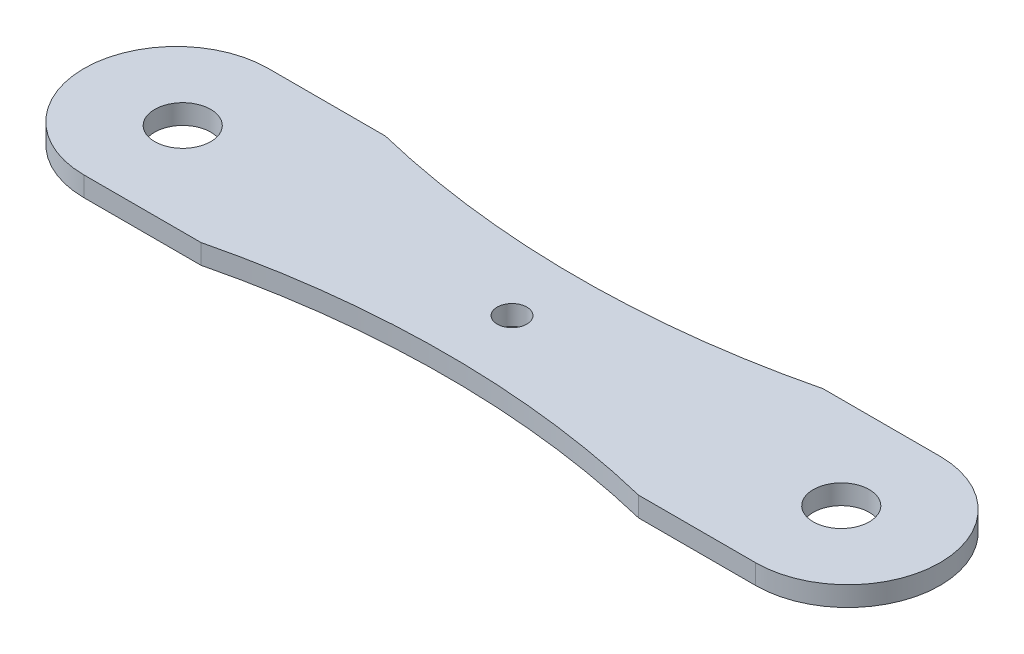
ISO-10303-21;
HEADER;
FILE_DESCRIPTION(('STEP AP214'),'2;1');
FILE_NAME('part.step','',(''),(''),'','','');
FILE_SCHEMA(('AUTOMOTIVE_DESIGN { 1 0 10303 214 1 1 1 1 }'));
ENDSEC;
DATA;
#1=APPLICATION_CONTEXT('core data for automotive mechanical design processes');
#2=APPLICATION_PROTOCOL_DEFINITION('international standard','automotive_design',2000,#1);
#3=PRODUCT_CONTEXT('',#1,'mechanical');
#4=PRODUCT('Part','Part','',(#3));
#5=PRODUCT_RELATED_PRODUCT_CATEGORY('part','',(#4));
#6=PRODUCT_DEFINITION_FORMATION('','',#4);
#7=PRODUCT_DEFINITION_CONTEXT('part definition',#1,'design');
#8=PRODUCT_DEFINITION('design','',#6,#7);
#9=PRODUCT_DEFINITION_SHAPE('','',#8);
#10=(LENGTH_UNIT() NAMED_UNIT(*) SI_UNIT(.MILLI.,.METRE.));
#11=(NAMED_UNIT(*) PLANE_ANGLE_UNIT() SI_UNIT($,.RADIAN.));
#12=(NAMED_UNIT(*) SI_UNIT($,.STERADIAN.) SOLID_ANGLE_UNIT());
#13=UNCERTAINTY_MEASURE_WITH_UNIT(LENGTH_MEASURE(1.E-05),#10,'distance_accuracy_value','');
#14=(GEOMETRIC_REPRESENTATION_CONTEXT(3) GLOBAL_UNCERTAINTY_ASSIGNED_CONTEXT((#13)) GLOBAL_UNIT_ASSIGNED_CONTEXT((#10,
#11,#12)) REPRESENTATION_CONTEXT('',''));
#15=CARTESIAN_POINT('',(0.,0.,0.));
#16=DIRECTION('',(0.,0.,1.));
#17=DIRECTION('',(1.,0.,0.));
#18=AXIS2_PLACEMENT_3D('',#15,#16,#17);
#19=CARTESIAN_POINT('',(51.,0.,0.));
#20=DIRECTION('',(0.,-1.,0.));
#21=DIRECTION('',(0.,0.,-1.));
#22=AXIS2_PLACEMENT_3D('',#19,#20,#21);
#23=CYLINDRICAL_SURFACE('',#22,14.);
#24=DIRECTION('',(0.,1.,0.));
#25=VECTOR('',#24,1.);
#26=CARTESIAN_POINT('',(51.,0.,14.));
#27=LINE('',#26,#25);
#28=CARTESIAN_POINT('',(51.,0.,14.));
#29=VERTEX_POINT('',#28);
#30=CARTESIAN_POINT('',(51.,3.,14.));
#31=VERTEX_POINT('',#30);
#32=EDGE_CURVE('E141',#29,#31,#27,.T.);
#33=ORIENTED_EDGE('',*,*,#32,.F.);
#34=CARTESIAN_POINT('',(51.,0.,0.));
#35=DIRECTION('',(0.,1.,0.));
#36=DIRECTION('',(0.,0.,1.));
#37=AXIS2_PLACEMENT_3D('',#34,#35,#36);
#38=CIRCLE('',#37,14.);
#39=CARTESIAN_POINT('',(51.,0.,-14.));
#40=VERTEX_POINT('',#39);
#41=EDGE_CURVE('E42',#40,#29,#38,.F.);
#42=ORIENTED_EDGE('',*,*,#41,.F.);
#43=DIRECTION('',(0.,-1.,0.));
#44=VECTOR('',#43,1.);
#45=CARTESIAN_POINT('',(51.,3.,-14.));
#46=LINE('',#45,#44);
#47=CARTESIAN_POINT('',(51.,3.,-14.));
#48=VERTEX_POINT('',#47);
#49=EDGE_CURVE('E144',#48,#40,#46,.T.);
#50=ORIENTED_EDGE('',*,*,#49,.F.);
#51=CARTESIAN_POINT('',(51.,3.,0.));
#52=DIRECTION('',(0.,1.,0.));
#53=DIRECTION('',(0.,0.,1.));
#54=AXIS2_PLACEMENT_3D('',#51,#52,#53);
#55=CIRCLE('',#54,14.);
#56=EDGE_CURVE('E11',#31,#48,#55,.T.);
#57=ORIENTED_EDGE('',*,*,#56,.F.);
#58=EDGE_LOOP('',(#33,#42,#50,#57));
#59=FACE_BOUND('',#58,.T.);
#60=ADVANCED_FACE('F35',(#59),#23,.T.);
#61=CARTESIAN_POINT('',(0.,3.,14.));
#62=DIRECTION('',(0.,0.,-1.));
#63=DIRECTION('',(-1.,0.,0.));
#64=AXIS2_PLACEMENT_3D('',#61,#62,#63);
#65=PLANE('',#64);
#66=DIRECTION('',(0.,1.,0.));
#67=VECTOR('',#66,1.);
#68=CARTESIAN_POINT('',(-33.2264954516723,-0.00100000000000013,14.));
#69=LINE('',#68,#67);
#70=CARTESIAN_POINT('',(-33.2264954516723,0.,14.));
#71=VERTEX_POINT('',#70);
#72=CARTESIAN_POINT('',(-33.2264954516723,3.,14.));
#73=VERTEX_POINT('',#72);
#74=EDGE_CURVE('E99',#71,#73,#69,.T.);
#75=ORIENTED_EDGE('',*,*,#74,.T.);
#76=DIRECTION('',(1.,0.,0.));
#77=VECTOR('',#76,1.);
#78=CARTESIAN_POINT('',(0.,3.,14.));
#79=LINE('',#78,#77);
#80=CARTESIAN_POINT('',(-51.,3.,14.));
#81=VERTEX_POINT('',#80);
#82=EDGE_CURVE('E112',#81,#73,#79,.T.);
#83=ORIENTED_EDGE('',*,*,#82,.F.);
#84=DIRECTION('',(0.,-1.,0.));
#85=VECTOR('',#84,1.);
#86=CARTESIAN_POINT('',(-51.,3.,14.));
#87=LINE('',#86,#85);
#88=CARTESIAN_POINT('',(-51.,0.,14.));
#89=VERTEX_POINT('',#88);
#90=EDGE_CURVE('E120',#81,#89,#87,.T.);
#91=ORIENTED_EDGE('',*,*,#90,.T.);
#92=DIRECTION('',(1.,0.,0.));
#93=VECTOR('',#92,1.);
#94=CARTESIAN_POINT('',(0.,0.,14.));
#95=LINE('',#94,#93);
#96=EDGE_CURVE('E114',#89,#71,#95,.T.);
#97=ORIENTED_EDGE('',*,*,#96,.T.);
#98=EDGE_LOOP('',(#75,#83,#91,#97));
#99=FACE_BOUND('',#98,.T.);
#100=ADVANCED_FACE('F110',(#99),#65,.F.);
#101=CARTESIAN_POINT('',(33.2264954516723,0.,14.));
#102=VERTEX_POINT('',#101);
#103=EDGE_CURVE('E132',#102,#29,#95,.T.);
#104=ORIENTED_EDGE('',*,*,#103,.T.);
#105=ORIENTED_EDGE('',*,*,#32,.T.);
#106=CARTESIAN_POINT('',(33.2264954516723,3.,14.));
#107=VERTEX_POINT('',#106);
#108=EDGE_CURVE('E121',#107,#31,#79,.T.);
#109=ORIENTED_EDGE('',*,*,#108,.F.);
#110=DIRECTION('',(0.,1.,0.));
#111=VECTOR('',#110,1.);
#112=CARTESIAN_POINT('',(33.2264954516723,-0.00100000000000013,14.));
#113=LINE('',#112,#111);
#114=EDGE_CURVE('E102',#107,#102,#113,.F.);
#115=ORIENTED_EDGE('',*,*,#114,.T.);
#116=EDGE_LOOP('',(#104,#105,#109,#115));
#117=FACE_BOUND('',#116,.T.);
#118=ADVANCED_FACE('F153',(#117),#65,.F.);
#119=CARTESIAN_POINT('',(0.,3.,0.));
#120=DIRECTION('',(0.,1.,0.));
#121=DIRECTION('',(0.,0.,1.));
#122=AXIS2_PLACEMENT_3D('',#119,#120,#121);
#123=PLANE('',#122);
#124=CARTESIAN_POINT('',(-50.,3.,0.));
#125=DIRECTION('',(0.,1.,0.));
#126=DIRECTION('',(0.,0.,1.));
#127=AXIS2_PLACEMENT_3D('',#124,#125,#126);
#128=CIRCLE('',#127,4.25000000000001);
#129=CARTESIAN_POINT('',(-50.,3.,4.25000000000001));
#130=VERTEX_POINT('',#129);
#131=EDGE_CURVE('E179',#130,#130,#128,.T.);
#132=ORIENTED_EDGE('',*,*,#131,.F.);
#133=EDGE_LOOP('',(#132));
#134=FACE_BOUND('',#133,.T.);
#135=CARTESIAN_POINT('',(50.,3.,0.));
#136=DIRECTION('',(0.,1.,0.));
#137=DIRECTION('',(0.,0.,1.));
#138=AXIS2_PLACEMENT_3D('',#135,#136,#137);
#139=CIRCLE('',#138,4.25000000000001);
#140=CARTESIAN_POINT('',(50.,3.,4.25000000000001));
#141=VERTEX_POINT('',#140);
#142=EDGE_CURVE('E173',#141,#141,#139,.T.);
#143=ORIENTED_EDGE('',*,*,#142,.F.);
#144=EDGE_LOOP('',(#143));
#145=FACE_BOUND('',#144,.T.);
#146=CARTESIAN_POINT('',(0.,3.,0.));
#147=DIRECTION('',(0.,1.,0.));
#148=DIRECTION('',(0.,0.,1.));
#149=AXIS2_PLACEMENT_3D('',#146,#147,#148);
#150=CIRCLE('',#149,2.25);
#151=CARTESIAN_POINT('',(0.,3.,2.25));
#152=VERTEX_POINT('',#151);
#153=EDGE_CURVE('E167',#152,#152,#150,.T.);
#154=ORIENTED_EDGE('',*,*,#153,.F.);
#155=EDGE_LOOP('',(#154));
#156=FACE_BOUND('',#155,.T.);
#157=ORIENTED_EDGE('',*,*,#108,.T.);
#158=ORIENTED_EDGE('',*,*,#56,.T.);
#159=DIRECTION('',(1.,0.,0.));
#160=VECTOR('',#159,1.);
#161=CARTESIAN_POINT('',(0.,3.,-14.));
#162=LINE('',#161,#160);
#163=CARTESIAN_POINT('',(33.2264954516724,3.,-14.));
#164=VERTEX_POINT('',#163);
#165=EDGE_CURVE('E134',#164,#48,#162,.T.);
#166=ORIENTED_EDGE('',*,*,#165,.F.);
#167=CARTESIAN_POINT('',(0.,3.,-150.));
#168=DIRECTION('',(0.,1.,0.));
#169=DIRECTION('',(0.,0.,1.));
#170=AXIS2_PLACEMENT_3D('',#167,#168,#169);
#171=CIRCLE('',#170,140.);
#172=CARTESIAN_POINT('',(-33.2264954516724,3.,-14.));
#173=VERTEX_POINT('',#172);
#174=EDGE_CURVE('E163',#173,#164,#171,.T.);
#175=ORIENTED_EDGE('',*,*,#174,.F.);
#176=CARTESIAN_POINT('',(-51.,3.,-14.));
#177=VERTEX_POINT('',#176);
#178=EDGE_CURVE('E125',#177,#173,#162,.T.);
#179=ORIENTED_EDGE('',*,*,#178,.F.);
#180=CARTESIAN_POINT('',(-51.,3.,0.));
#181=DIRECTION('',(0.,1.,0.));
#182=DIRECTION('',(0.,0.,1.));
#183=AXIS2_PLACEMENT_3D('',#180,#181,#182);
#184=CIRCLE('',#183,14.);
#185=EDGE_CURVE('E118',#177,#81,#184,.T.);
#186=ORIENTED_EDGE('',*,*,#185,.T.);
#187=ORIENTED_EDGE('',*,*,#82,.T.);
#188=CARTESIAN_POINT('',(0.,3.,150.));
#189=DIRECTION('',(0.,-1.,0.));
#190=DIRECTION('',(0.,0.,-1.));
#191=AXIS2_PLACEMENT_3D('',#188,#189,#190);
#192=CIRCLE('',#191,140.);
#193=EDGE_CURVE('E96',#73,#107,#192,.T.);
#194=ORIENTED_EDGE('',*,*,#193,.T.);
#195=EDGE_LOOP('',(#157,#158,#166,#175,#179,#186,#187,#194));
#196=FACE_BOUND('',#195,.T.);
#197=ADVANCED_FACE('F116',(#134,#145,#156,#196),#123,.T.);
#198=CARTESIAN_POINT('',(0.,0.,0.));
#199=DIRECTION('',(0.,1.,0.));
#200=DIRECTION('',(0.,0.,1.));
#201=AXIS2_PLACEMENT_3D('',#198,#199,#200);
#202=PLANE('',#201);
#203=CARTESIAN_POINT('',(-50.,0.,0.));
#204=DIRECTION('',(0.,1.,0.));
#205=DIRECTION('',(0.,0.,1.));
#206=AXIS2_PLACEMENT_3D('',#203,#204,#205);
#207=CIRCLE('',#206,4.25000000000001);
#208=CARTESIAN_POINT('',(-50.,0.,4.25000000000001));
#209=VERTEX_POINT('',#208);
#210=EDGE_CURVE('E181',#209,#209,#207,.F.);
#211=ORIENTED_EDGE('',*,*,#210,.F.);
#212=EDGE_LOOP('',(#211));
#213=FACE_BOUND('',#212,.T.);
#214=CARTESIAN_POINT('',(50.,0.,0.));
#215=DIRECTION('',(0.,1.,0.));
#216=DIRECTION('',(0.,0.,1.));
#217=AXIS2_PLACEMENT_3D('',#214,#215,#216);
#218=CIRCLE('',#217,4.25000000000001);
#219=CARTESIAN_POINT('',(50.,0.,4.25000000000001));
#220=VERTEX_POINT('',#219);
#221=EDGE_CURVE('E176',#220,#220,#218,.F.);
#222=ORIENTED_EDGE('',*,*,#221,.F.);
#223=EDGE_LOOP('',(#222));
#224=FACE_BOUND('',#223,.T.);
#225=CARTESIAN_POINT('',(0.,0.,0.));
#226=DIRECTION('',(0.,1.,0.));
#227=DIRECTION('',(0.,0.,1.));
#228=AXIS2_PLACEMENT_3D('',#225,#226,#227);
#229=CIRCLE('',#228,2.25);
#230=CARTESIAN_POINT('',(0.,0.,2.25));
#231=VERTEX_POINT('',#230);
#232=EDGE_CURVE('E170',#231,#231,#229,.F.);
#233=ORIENTED_EDGE('',*,*,#232,.F.);
#234=EDGE_LOOP('',(#233));
#235=FACE_BOUND('',#234,.T.);
#236=DIRECTION('',(1.,0.,0.));
#237=VECTOR('',#236,1.);
#238=CARTESIAN_POINT('',(0.,0.,-14.));
#239=LINE('',#238,#237);
#240=CARTESIAN_POINT('',(33.2264954516724,0.,-14.));
#241=VERTEX_POINT('',#240);
#242=EDGE_CURVE('E133',#241,#40,#239,.T.);
#243=ORIENTED_EDGE('',*,*,#242,.T.);
#244=ORIENTED_EDGE('',*,*,#41,.T.);
#245=ORIENTED_EDGE('',*,*,#103,.F.);
#246=CARTESIAN_POINT('',(0.,0.,150.));
#247=DIRECTION('',(0.,1.,0.));
#248=DIRECTION('',(0.,0.,1.));
#249=AXIS2_PLACEMENT_3D('',#246,#247,#248);
#250=CIRCLE('',#249,140.);
#251=EDGE_CURVE('E105',#102,#71,#250,.T.);
#252=ORIENTED_EDGE('',*,*,#251,.T.);
#253=ORIENTED_EDGE('',*,*,#96,.F.);
#254=CARTESIAN_POINT('',(-51.,0.,0.));
#255=DIRECTION('',(0.,1.,0.));
#256=DIRECTION('',(0.,0.,1.));
#257=AXIS2_PLACEMENT_3D('',#254,#255,#256);
#258=CIRCLE('',#257,14.);
#259=CARTESIAN_POINT('',(-51.,0.,-14.));
#260=VERTEX_POINT('',#259);
#261=EDGE_CURVE('E139',#89,#260,#258,.F.);
#262=ORIENTED_EDGE('',*,*,#261,.T.);
#263=CARTESIAN_POINT('',(-33.2264954516724,0.,-14.));
#264=VERTEX_POINT('',#263);
#265=EDGE_CURVE('E129',#260,#264,#239,.T.);
#266=ORIENTED_EDGE('',*,*,#265,.T.);
#267=CARTESIAN_POINT('',(0.,0.,-150.));
#268=DIRECTION('',(0.,1.,0.));
#269=DIRECTION('',(0.,0.,1.));
#270=AXIS2_PLACEMENT_3D('',#267,#268,#269);
#271=CIRCLE('',#270,140.);
#272=EDGE_CURVE('E165',#241,#264,#271,.F.);
#273=ORIENTED_EDGE('',*,*,#272,.F.);
#274=EDGE_LOOP('',(#243,#244,#245,#252,#253,#262,#266,#273));
#275=FACE_BOUND('',#274,.T.);
#276=ADVANCED_FACE('F148',(#213,#224,#235,#275),#202,.F.);
#277=CARTESIAN_POINT('',(0.,3.,-14.));
#278=DIRECTION('',(0.,0.,-1.));
#279=DIRECTION('',(-1.,0.,0.));
#280=AXIS2_PLACEMENT_3D('',#277,#278,#279);
#281=PLANE('',#280);
#282=DIRECTION('',(0.,1.,0.));
#283=VECTOR('',#282,1.);
#284=CARTESIAN_POINT('',(-33.2264954516724,-0.00100000000000013,-14.));
#285=LINE('',#284,#283);
#286=EDGE_CURVE('E160',#173,#264,#285,.F.);
#287=ORIENTED_EDGE('',*,*,#286,.T.);
#288=ORIENTED_EDGE('',*,*,#265,.F.);
#289=DIRECTION('',(0.,1.,0.));
#290=VECTOR('',#289,1.);
#291=CARTESIAN_POINT('',(-51.,3.,-14.));
#292=LINE('',#291,#290);
#293=EDGE_CURVE('E123',#260,#177,#292,.T.);
#294=ORIENTED_EDGE('',*,*,#293,.T.);
#295=ORIENTED_EDGE('',*,*,#178,.T.);
#296=EDGE_LOOP('',(#287,#288,#294,#295));
#297=FACE_BOUND('',#296,.T.);
#298=ADVANCED_FACE('F189',(#297),#281,.T.);
#299=CARTESIAN_POINT('',(-51.,3.,0.));
#300=DIRECTION('',(0.,-1.,0.));
#301=DIRECTION('',(0.,0.,-1.));
#302=AXIS2_PLACEMENT_3D('',#299,#300,#301);
#303=CYLINDRICAL_SURFACE('',#302,14.);
#304=ORIENTED_EDGE('',*,*,#90,.F.);
#305=ORIENTED_EDGE('',*,*,#185,.F.);
#306=ORIENTED_EDGE('',*,*,#293,.F.);
#307=ORIENTED_EDGE('',*,*,#261,.F.);
#308=EDGE_LOOP('',(#304,#305,#306,#307));
#309=FACE_BOUND('',#308,.T.);
#310=ADVANCED_FACE('F223',(#309),#303,.T.);
#311=ORIENTED_EDGE('',*,*,#165,.T.);
#312=ORIENTED_EDGE('',*,*,#49,.T.);
#313=ORIENTED_EDGE('',*,*,#242,.F.);
#314=DIRECTION('',(0.,1.,0.));
#315=VECTOR('',#314,1.);
#316=CARTESIAN_POINT('',(33.2264954516724,-0.00100000000000013,-14.));
#317=LINE('',#316,#315);
#318=EDGE_CURVE('E157',#241,#164,#317,.T.);
#319=ORIENTED_EDGE('',*,*,#318,.T.);
#320=EDGE_LOOP('',(#311,#312,#313,#319));
#321=FACE_BOUND('',#320,.T.);
#322=ADVANCED_FACE('F221',(#321),#281,.T.);
#323=CARTESIAN_POINT('',(-50.,-0.00100000000000013,0.));
#324=DIRECTION('',(0.,1.,0.));
#325=DIRECTION('',(0.,0.,1.));
#326=AXIS2_PLACEMENT_3D('',#323,#324,#325);
#327=CYLINDRICAL_SURFACE('',#326,4.25000000000001);
#328=CARTESIAN_POINT('',(-50.,3.,4.25000000000001));
#329=CARTESIAN_POINT('',(-50.,2.96875,4.25000000000001));
#330=CARTESIAN_POINT('',(-50.,2.9375,4.25000000000001));
#331=CARTESIAN_POINT('',(-50.,2.875,4.25000000000001));
#332=CARTESIAN_POINT('',(-50.,2.84375,4.25000000000001));
#333=CARTESIAN_POINT('',(-50.,2.78125,4.25000000000001));
#334=CARTESIAN_POINT('',(-50.,2.75,4.25000000000001));
#335=CARTESIAN_POINT('',(-50.,2.6875,4.25000000000001));
#336=CARTESIAN_POINT('',(-50.,2.65625,4.25000000000001));
#337=CARTESIAN_POINT('',(-50.,2.59375,4.25000000000001));
#338=CARTESIAN_POINT('',(-50.,2.5625,4.25000000000001));
#339=CARTESIAN_POINT('',(-50.,2.5,4.25000000000001));
#340=CARTESIAN_POINT('',(-50.,2.46875,4.25000000000001));
#341=CARTESIAN_POINT('',(-50.,2.40625,4.25000000000001));
#342=CARTESIAN_POINT('',(-50.,2.375,4.25000000000001));
#343=CARTESIAN_POINT('',(-50.,2.3125,4.25000000000001));
#344=CARTESIAN_POINT('',(-50.,2.28125,4.25000000000001));
#345=CARTESIAN_POINT('',(-50.,2.21875,4.25000000000001));
#346=CARTESIAN_POINT('',(-50.,2.1875,4.25000000000001));
#347=CARTESIAN_POINT('',(-50.,2.125,4.25000000000001));
#348=CARTESIAN_POINT('',(-50.,2.09375,4.25000000000001));
#349=CARTESIAN_POINT('',(-50.,2.03125,4.25000000000001));
#350=CARTESIAN_POINT('',(-50.,2.,4.25000000000001));
#351=CARTESIAN_POINT('',(-50.,1.9375,4.25000000000001));
#352=CARTESIAN_POINT('',(-50.,1.90625,4.25000000000001));
#353=CARTESIAN_POINT('',(-50.,1.84375,4.25000000000001));
#354=CARTESIAN_POINT('',(-50.,1.8125,4.25000000000001));
#355=CARTESIAN_POINT('',(-50.,1.75,4.25000000000001));
#356=CARTESIAN_POINT('',(-50.,1.71875,4.25000000000001));
#357=CARTESIAN_POINT('',(-50.,1.65625,4.25000000000001));
#358=CARTESIAN_POINT('',(-50.,1.625,4.25000000000001));
#359=CARTESIAN_POINT('',(-50.,1.5625,4.25000000000001));
#360=CARTESIAN_POINT('',(-50.,1.53125,4.25000000000001));
#361=CARTESIAN_POINT('',(-50.,1.46875,4.25000000000001));
#362=CARTESIAN_POINT('',(-50.,1.4375,4.25000000000001));
#363=CARTESIAN_POINT('',(-50.,1.375,4.25000000000001));
#364=CARTESIAN_POINT('',(-50.,1.34375,4.25000000000001));
#365=CARTESIAN_POINT('',(-50.,1.28125,4.25000000000001));
#366=CARTESIAN_POINT('',(-50.,1.25,4.25000000000001));
#367=CARTESIAN_POINT('',(-50.,1.1875,4.25000000000001));
#368=CARTESIAN_POINT('',(-50.,1.15625,4.25000000000001));
#369=CARTESIAN_POINT('',(-50.,1.09375,4.25000000000001));
#370=CARTESIAN_POINT('',(-50.,1.0625,4.25000000000001));
#371=CARTESIAN_POINT('',(-50.,1.,4.25000000000001));
#372=CARTESIAN_POINT('',(-50.,0.96875,4.25000000000001));
#373=CARTESIAN_POINT('',(-50.,0.90625,4.25000000000001));
#374=CARTESIAN_POINT('',(-50.,0.875,4.25000000000001));
#375=CARTESIAN_POINT('',(-50.,0.8125,4.25000000000001));
#376=CARTESIAN_POINT('',(-50.,0.78125,4.25000000000001));
#377=CARTESIAN_POINT('',(-50.,0.71875,4.25000000000001));
#378=CARTESIAN_POINT('',(-50.,0.6875,4.25000000000001));
#379=CARTESIAN_POINT('',(-50.,0.625,4.25000000000001));
#380=CARTESIAN_POINT('',(-50.,0.59375,4.25000000000001));
#381=CARTESIAN_POINT('',(-50.,0.53125,4.25000000000001));
#382=CARTESIAN_POINT('',(-50.,0.5,4.25000000000001));
#383=CARTESIAN_POINT('',(-50.,0.4375,4.25000000000001));
#384=CARTESIAN_POINT('',(-50.,0.40625,4.25000000000001));
#385=CARTESIAN_POINT('',(-50.,0.34375,4.25000000000001));
#386=CARTESIAN_POINT('',(-50.,0.3125,4.25000000000001));
#387=CARTESIAN_POINT('',(-50.,0.25,4.25000000000001));
#388=CARTESIAN_POINT('',(-50.,0.21875,4.25000000000001));
#389=CARTESIAN_POINT('',(-50.,0.15625,4.25000000000001));
#390=CARTESIAN_POINT('',(-50.,0.125,4.25000000000001));
#391=CARTESIAN_POINT('',(-50.,0.0625000000000001,4.25000000000001));
#392=CARTESIAN_POINT('',(-50.,0.0312500000000001,4.25000000000001));
#393=CARTESIAN_POINT('',(-50.,0.,4.25000000000001));
#394=B_SPLINE_CURVE_WITH_KNOTS('',3,(#328,#329,#330,#331,#332,#333,#334,#335,#336,#337,#338,
#339,#340,#341,#342,#343,#344,#345,#346,#347,#348,#349,#350,#351,#352,#353,#354,#355,#356,#357,
#358,#359,#360,#361,#362,#363,#364,#365,#366,#367,#368,#369,#370,#371,#372,#373,#374,#375,#376,
#377,#378,#379,#380,#381,#382,#383,#384,#385,#386,#387,#388,#389,#390,#391,#392,#393),
.UNSPECIFIED.,.F.,.F.,(4,2,2,2,2,2,2,2,2,2,2,2,2,2,2,2,2,2,2,2,2,2,2,2,2,2,2,2,2,2,2,2,4),(0.,
0.0937500000000001,0.1875,0.28125,0.375,0.46875,0.5625,0.65625,0.75,0.84375,0.9375,1.03125,
1.125,1.21875,1.3125,1.40625,1.5,1.59375,1.6875,1.78125,1.875,1.96875,2.0625,2.15625,2.25,
2.34375,2.4375,2.53125,2.625,2.71875,2.8125,2.90625,3.),.UNSPECIFIED.);
#395=EDGE_CURVE('BSEAM185',#130,#209,#394,.T.);
#396=ORIENTED_EDGE('',*,*,#131,.T.);
#397=ORIENTED_EDGE('',*,*,#210,.T.);
#398=ORIENTED_EDGE('',*,*,#395,.T.);
#399=ORIENTED_EDGE('',*,*,#395,.F.);
#400=EDGE_LOOP('',(#396,#398,#397,#399));
#401=FACE_BOUND('',#400,.T.);
#402=ADVANCED_FACE('F185',(#401),#327,.F.);
#403=CARTESIAN_POINT('',(50.,-0.00100000000000013,0.));
#404=DIRECTION('',(0.,1.,0.));
#405=DIRECTION('',(0.,0.,1.));
#406=AXIS2_PLACEMENT_3D('',#403,#404,#405);
#407=CYLINDRICAL_SURFACE('',#406,4.25000000000001);
#408=CARTESIAN_POINT('',(50.,3.,4.25000000000001));
#409=CARTESIAN_POINT('',(50.,2.96875,4.25000000000001));
#410=CARTESIAN_POINT('',(50.,2.9375,4.25000000000001));
#411=CARTESIAN_POINT('',(50.,2.875,4.25000000000001));
#412=CARTESIAN_POINT('',(50.,2.84375,4.25000000000001));
#413=CARTESIAN_POINT('',(50.,2.78125,4.25000000000001));
#414=CARTESIAN_POINT('',(50.,2.75,4.25000000000001));
#415=CARTESIAN_POINT('',(50.,2.6875,4.25000000000001));
#416=CARTESIAN_POINT('',(50.,2.65625,4.25000000000001));
#417=CARTESIAN_POINT('',(50.,2.59375,4.25000000000001));
#418=CARTESIAN_POINT('',(50.,2.5625,4.25000000000001));
#419=CARTESIAN_POINT('',(50.,2.5,4.25000000000001));
#420=CARTESIAN_POINT('',(50.,2.46875,4.25000000000001));
#421=CARTESIAN_POINT('',(50.,2.40625,4.25000000000001));
#422=CARTESIAN_POINT('',(50.,2.375,4.25000000000001));
#423=CARTESIAN_POINT('',(50.,2.3125,4.25000000000001));
#424=CARTESIAN_POINT('',(50.,2.28125,4.25000000000001));
#425=CARTESIAN_POINT('',(50.,2.21875,4.25000000000001));
#426=CARTESIAN_POINT('',(50.,2.1875,4.25000000000001));
#427=CARTESIAN_POINT('',(50.,2.125,4.25000000000001));
#428=CARTESIAN_POINT('',(50.,2.09375,4.25000000000001));
#429=CARTESIAN_POINT('',(50.,2.03125,4.25000000000001));
#430=CARTESIAN_POINT('',(50.,2.,4.25000000000001));
#431=CARTESIAN_POINT('',(50.,1.9375,4.25000000000001));
#432=CARTESIAN_POINT('',(50.,1.90625,4.25000000000001));
#433=CARTESIAN_POINT('',(50.,1.84375,4.25000000000001));
#434=CARTESIAN_POINT('',(50.,1.8125,4.25000000000001));
#435=CARTESIAN_POINT('',(50.,1.75,4.25000000000001));
#436=CARTESIAN_POINT('',(50.,1.71875,4.25000000000001));
#437=CARTESIAN_POINT('',(50.,1.65625,4.25000000000001));
#438=CARTESIAN_POINT('',(50.,1.625,4.25000000000001));
#439=CARTESIAN_POINT('',(50.,1.5625,4.25000000000001));
#440=CARTESIAN_POINT('',(50.,1.53125,4.25000000000001));
#441=CARTESIAN_POINT('',(50.,1.46875,4.25000000000001));
#442=CARTESIAN_POINT('',(50.,1.4375,4.25000000000001));
#443=CARTESIAN_POINT('',(50.,1.375,4.25000000000001));
#444=CARTESIAN_POINT('',(50.,1.34375,4.25000000000001));
#445=CARTESIAN_POINT('',(50.,1.28125,4.25000000000001));
#446=CARTESIAN_POINT('',(50.,1.25,4.25000000000001));
#447=CARTESIAN_POINT('',(50.,1.1875,4.25000000000001));
#448=CARTESIAN_POINT('',(50.,1.15625,4.25000000000001));
#449=CARTESIAN_POINT('',(50.,1.09375,4.25000000000001));
#450=CARTESIAN_POINT('',(50.,1.0625,4.25000000000001));
#451=CARTESIAN_POINT('',(50.,1.,4.25000000000001));
#452=CARTESIAN_POINT('',(50.,0.96875,4.25000000000001));
#453=CARTESIAN_POINT('',(50.,0.90625,4.25000000000001));
#454=CARTESIAN_POINT('',(50.,0.875,4.25000000000001));
#455=CARTESIAN_POINT('',(50.,0.8125,4.25000000000001));
#456=CARTESIAN_POINT('',(50.,0.78125,4.25000000000001));
#457=CARTESIAN_POINT('',(50.,0.71875,4.25000000000001));
#458=CARTESIAN_POINT('',(50.,0.6875,4.25000000000001));
#459=CARTESIAN_POINT('',(50.,0.625,4.25000000000001));
#460=CARTESIAN_POINT('',(50.,0.59375,4.25000000000001));
#461=CARTESIAN_POINT('',(50.,0.53125,4.25000000000001));
#462=CARTESIAN_POINT('',(50.,0.5,4.25000000000001));
#463=CARTESIAN_POINT('',(50.,0.4375,4.25000000000001));
#464=CARTESIAN_POINT('',(50.,0.40625,4.25000000000001));
#465=CARTESIAN_POINT('',(50.,0.34375,4.25000000000001));
#466=CARTESIAN_POINT('',(50.,0.3125,4.25000000000001));
#467=CARTESIAN_POINT('',(50.,0.25,4.25000000000001));
#468=CARTESIAN_POINT('',(50.,0.21875,4.25000000000001));
#469=CARTESIAN_POINT('',(50.,0.15625,4.25000000000001));
#470=CARTESIAN_POINT('',(50.,0.125,4.25000000000001));
#471=CARTESIAN_POINT('',(50.,0.0625000000000001,4.25000000000001));
#472=CARTESIAN_POINT('',(50.,0.0312500000000001,4.25000000000001));
#473=CARTESIAN_POINT('',(50.,0.,4.25000000000001));
#474=B_SPLINE_CURVE_WITH_KNOTS('',3,(#408,#409,#410,#411,#412,#413,#414,#415,#416,#417,#418,
#419,#420,#421,#422,#423,#424,#425,#426,#427,#428,#429,#430,#431,#432,#433,#434,#435,#436,#437,
#438,#439,#440,#441,#442,#443,#444,#445,#446,#447,#448,#449,#450,#451,#452,#453,#454,#455,#456,
#457,#458,#459,#460,#461,#462,#463,#464,#465,#466,#467,#468,#469,#470,#471,#472,#473),
.UNSPECIFIED.,.F.,.F.,(4,2,2,2,2,2,2,2,2,2,2,2,2,2,2,2,2,2,2,2,2,2,2,2,2,2,2,2,2,2,2,2,4),(0.,
0.0937500000000001,0.1875,0.28125,0.375,0.46875,0.5625,0.65625,0.75,0.84375,0.9375,1.03125,
1.125,1.21875,1.3125,1.40625,1.5,1.59375,1.6875,1.78125,1.875,1.96875,2.0625,2.15625,2.25,
2.34375,2.4375,2.53125,2.625,2.71875,2.8125,2.90625,3.),.UNSPECIFIED.);
#475=EDGE_CURVE('BSEAM198',#141,#220,#474,.T.);
#476=ORIENTED_EDGE('',*,*,#142,.T.);
#477=ORIENTED_EDGE('',*,*,#221,.T.);
#478=ORIENTED_EDGE('',*,*,#475,.T.);
#479=ORIENTED_EDGE('',*,*,#475,.F.);
#480=EDGE_LOOP('',(#476,#478,#477,#479));
#481=FACE_BOUND('',#480,.T.);
#482=ADVANCED_FACE('F198',(#481),#407,.F.);
#483=CARTESIAN_POINT('',(0.,-0.00100000000000013,0.));
#484=DIRECTION('',(0.,1.,0.));
#485=DIRECTION('',(0.,0.,1.));
#486=AXIS2_PLACEMENT_3D('',#483,#484,#485);
#487=CYLINDRICAL_SURFACE('',#486,2.25);
#488=CARTESIAN_POINT('',(0.,3.,2.25));
#489=CARTESIAN_POINT('',(0.,2.96875,2.25));
#490=CARTESIAN_POINT('',(0.,2.9375,2.25));
#491=CARTESIAN_POINT('',(0.,2.875,2.25));
#492=CARTESIAN_POINT('',(0.,2.84375,2.25));
#493=CARTESIAN_POINT('',(0.,2.78125,2.25));
#494=CARTESIAN_POINT('',(0.,2.75,2.25));
#495=CARTESIAN_POINT('',(0.,2.6875,2.25));
#496=CARTESIAN_POINT('',(0.,2.65625,2.25));
#497=CARTESIAN_POINT('',(0.,2.59375,2.25));
#498=CARTESIAN_POINT('',(0.,2.5625,2.25));
#499=CARTESIAN_POINT('',(0.,2.5,2.25));
#500=CARTESIAN_POINT('',(0.,2.46875,2.25));
#501=CARTESIAN_POINT('',(0.,2.40625,2.25));
#502=CARTESIAN_POINT('',(0.,2.375,2.25));
#503=CARTESIAN_POINT('',(0.,2.3125,2.25));
#504=CARTESIAN_POINT('',(0.,2.28125,2.25));
#505=CARTESIAN_POINT('',(0.,2.21875,2.25));
#506=CARTESIAN_POINT('',(0.,2.1875,2.25));
#507=CARTESIAN_POINT('',(0.,2.125,2.25));
#508=CARTESIAN_POINT('',(0.,2.09375,2.25));
#509=CARTESIAN_POINT('',(0.,2.03125,2.25));
#510=CARTESIAN_POINT('',(0.,2.,2.25));
#511=CARTESIAN_POINT('',(0.,1.9375,2.25));
#512=CARTESIAN_POINT('',(0.,1.90625,2.25));
#513=CARTESIAN_POINT('',(0.,1.84375,2.25));
#514=CARTESIAN_POINT('',(0.,1.8125,2.25));
#515=CARTESIAN_POINT('',(0.,1.75,2.25));
#516=CARTESIAN_POINT('',(0.,1.71875,2.25));
#517=CARTESIAN_POINT('',(0.,1.65625,2.25));
#518=CARTESIAN_POINT('',(0.,1.625,2.25));
#519=CARTESIAN_POINT('',(0.,1.5625,2.25));
#520=CARTESIAN_POINT('',(0.,1.53125,2.25));
#521=CARTESIAN_POINT('',(0.,1.46875,2.25));
#522=CARTESIAN_POINT('',(0.,1.4375,2.25));
#523=CARTESIAN_POINT('',(0.,1.375,2.25));
#524=CARTESIAN_POINT('',(0.,1.34375,2.25));
#525=CARTESIAN_POINT('',(0.,1.28125,2.25));
#526=CARTESIAN_POINT('',(0.,1.25,2.25));
#527=CARTESIAN_POINT('',(0.,1.1875,2.25));
#528=CARTESIAN_POINT('',(0.,1.15625,2.25));
#529=CARTESIAN_POINT('',(0.,1.09375,2.25));
#530=CARTESIAN_POINT('',(0.,1.0625,2.25));
#531=CARTESIAN_POINT('',(0.,1.,2.25));
#532=CARTESIAN_POINT('',(0.,0.96875,2.25));
#533=CARTESIAN_POINT('',(0.,0.90625,2.25));
#534=CARTESIAN_POINT('',(0.,0.875,2.25));
#535=CARTESIAN_POINT('',(0.,0.8125,2.25));
#536=CARTESIAN_POINT('',(0.,0.78125,2.25));
#537=CARTESIAN_POINT('',(0.,0.71875,2.25));
#538=CARTESIAN_POINT('',(0.,0.6875,2.25));
#539=CARTESIAN_POINT('',(0.,0.625,2.25));
#540=CARTESIAN_POINT('',(0.,0.59375,2.25));
#541=CARTESIAN_POINT('',(0.,0.53125,2.25));
#542=CARTESIAN_POINT('',(0.,0.5,2.25));
#543=CARTESIAN_POINT('',(0.,0.4375,2.25));
#544=CARTESIAN_POINT('',(0.,0.40625,2.25));
#545=CARTESIAN_POINT('',(0.,0.34375,2.25));
#546=CARTESIAN_POINT('',(0.,0.3125,2.25));
#547=CARTESIAN_POINT('',(0.,0.25,2.25));
#548=CARTESIAN_POINT('',(0.,0.21875,2.25));
#549=CARTESIAN_POINT('',(0.,0.15625,2.25));
#550=CARTESIAN_POINT('',(0.,0.125,2.25));
#551=CARTESIAN_POINT('',(0.,0.0625000000000001,2.25));
#552=CARTESIAN_POINT('',(0.,0.0312500000000001,2.25));
#553=CARTESIAN_POINT('',(0.,0.,2.25));
#554=B_SPLINE_CURVE_WITH_KNOTS('',3,(#488,#489,#490,#491,#492,#493,#494,#495,#496,#497,#498,
#499,#500,#501,#502,#503,#504,#505,#506,#507,#508,#509,#510,#511,#512,#513,#514,#515,#516,#517,
#518,#519,#520,#521,#522,#523,#524,#525,#526,#527,#528,#529,#530,#531,#532,#533,#534,#535,#536,
#537,#538,#539,#540,#541,#542,#543,#544,#545,#546,#547,#548,#549,#550,#551,#552,#553),
.UNSPECIFIED.,.F.,.F.,(4,2,2,2,2,2,2,2,2,2,2,2,2,2,2,2,2,2,2,2,2,2,2,2,2,2,2,2,2,2,2,2,4),(0.,
0.0937500000000001,0.1875,0.28125,0.375,0.46875,0.5625,0.65625,0.75,0.84375,0.9375,1.03125,
1.125,1.21875,1.3125,1.40625,1.5,1.59375,1.6875,1.78125,1.875,1.96875,2.0625,2.15625,2.25,
2.34375,2.4375,2.53125,2.625,2.71875,2.8125,2.90625,3.),.UNSPECIFIED.);
#555=EDGE_CURVE('BSEAM195',#152,#231,#554,.T.);
#556=ORIENTED_EDGE('',*,*,#153,.T.);
#557=ORIENTED_EDGE('',*,*,#232,.T.);
#558=ORIENTED_EDGE('',*,*,#555,.T.);
#559=ORIENTED_EDGE('',*,*,#555,.F.);
#560=EDGE_LOOP('',(#556,#558,#557,#559));
#561=FACE_BOUND('',#560,.T.);
#562=ADVANCED_FACE('F195',(#561),#487,.F.);
#563=CARTESIAN_POINT('',(0.,-0.00100000000000013,-150.));
#564=DIRECTION('',(0.,1.,0.));
#565=DIRECTION('',(0.,0.,1.));
#566=AXIS2_PLACEMENT_3D('',#563,#564,#565);
#567=CYLINDRICAL_SURFACE('',#566,140.);
#568=ORIENTED_EDGE('',*,*,#174,.T.);
#569=ORIENTED_EDGE('',*,*,#318,.F.);
#570=ORIENTED_EDGE('',*,*,#272,.T.);
#571=ORIENTED_EDGE('',*,*,#286,.F.);
#572=EDGE_LOOP('',(#568,#569,#570,#571));
#573=FACE_BOUND('',#572,.T.);
#574=ADVANCED_FACE('F197',(#573),#567,.F.);
#575=CARTESIAN_POINT('',(0.,-0.00100000000000013,150.));
#576=DIRECTION('',(0.,1.,0.));
#577=DIRECTION('',(0.,0.,1.));
#578=AXIS2_PLACEMENT_3D('',#575,#576,#577);
#579=CYLINDRICAL_SURFACE('',#578,140.);
#580=ORIENTED_EDGE('',*,*,#251,.F.);
#581=ORIENTED_EDGE('',*,*,#114,.F.);
#582=ORIENTED_EDGE('',*,*,#193,.F.);
#583=ORIENTED_EDGE('',*,*,#74,.F.);
#584=EDGE_LOOP('',(#580,#581,#582,#583));
#585=FACE_BOUND('',#584,.T.);
#586=ADVANCED_FACE('F98',(#585),#579,.F.);
#587=CLOSED_SHELL('',(#60,#100,#118,#197,#276,#298,#310,#322,#402,#482,#562,#574,#586));
#588=MANIFOLD_SOLID_BREP('B2',#587);
#589=ADVANCED_BREP_SHAPE_REPRESENTATION('',(#18,#588),#14);
#590=SHAPE_DEFINITION_REPRESENTATION(#9,#589);
ENDSEC;
END-ISO-10303-21;
